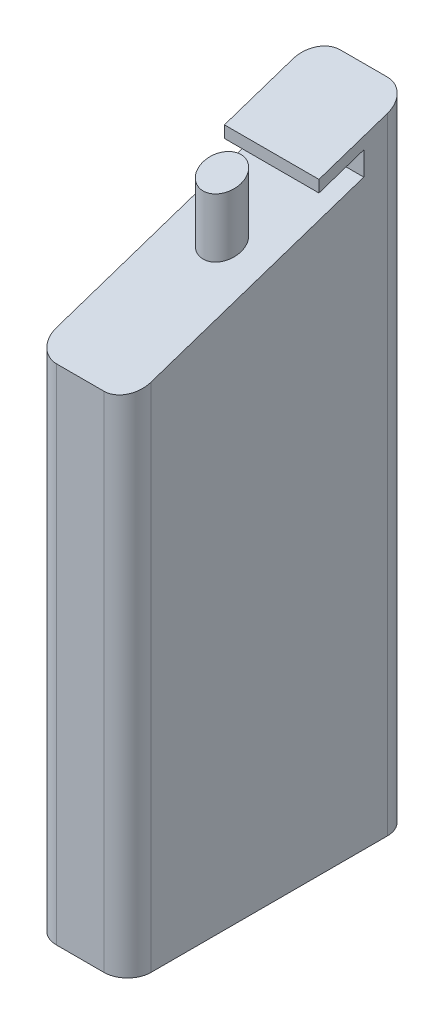
ISO-10303-21;
HEADER;
FILE_DESCRIPTION(('STEP AP214'),'2;1');
FILE_NAME('part.step','',(''),(''),'','','');
FILE_SCHEMA(('AUTOMOTIVE_DESIGN { 1 0 10303 214 1 1 1 1 }'));
ENDSEC;
DATA;
#1=APPLICATION_CONTEXT('core data for automotive mechanical design processes');
#2=APPLICATION_PROTOCOL_DEFINITION('international standard','automotive_design',2000,#1);
#3=PRODUCT_CONTEXT('',#1,'mechanical');
#4=PRODUCT('Part','Part','',(#3));
#5=PRODUCT_RELATED_PRODUCT_CATEGORY('part','',(#4));
#6=PRODUCT_DEFINITION_FORMATION('','',#4);
#7=PRODUCT_DEFINITION_CONTEXT('part definition',#1,'design');
#8=PRODUCT_DEFINITION('design','',#6,#7);
#9=PRODUCT_DEFINITION_SHAPE('','',#8);
#10=(LENGTH_UNIT() NAMED_UNIT(*) SI_UNIT(.MILLI.,.METRE.));
#11=(NAMED_UNIT(*) PLANE_ANGLE_UNIT() SI_UNIT($,.RADIAN.));
#12=(NAMED_UNIT(*) SI_UNIT($,.STERADIAN.) SOLID_ANGLE_UNIT());
#13=UNCERTAINTY_MEASURE_WITH_UNIT(LENGTH_MEASURE(1.E-05),#10,'distance_accuracy_value','');
#14=(GEOMETRIC_REPRESENTATION_CONTEXT(3) GLOBAL_UNCERTAINTY_ASSIGNED_CONTEXT((#13)) GLOBAL_UNIT_ASSIGNED_CONTEXT((#10,
#11,#12)) REPRESENTATION_CONTEXT('',''));
#15=CARTESIAN_POINT('',(0.,0.,0.));
#16=DIRECTION('',(0.,0.,1.));
#17=DIRECTION('',(1.,0.,0.));
#18=AXIS2_PLACEMENT_3D('',#15,#16,#17);
#19=CARTESIAN_POINT('',(-12.7,166.057639442324,-25.4));
#20=DIRECTION('',(0.,0.,-1.));
#21=DIRECTION('',(-1.,0.,0.));
#22=AXIS2_PLACEMENT_3D('',#19,#20,#21);
#23=PLANE('',#22);
#24=DIRECTION('',(1.,0.,0.));
#25=VECTOR('',#24,1.);
#26=CARTESIAN_POINT('',(-12.7,162.882639442324,-25.4));
#27=LINE('',#26,#25);
#28=CARTESIAN_POINT('',(-12.7,162.882639442324,-25.4));
#29=VERTEX_POINT('',#28);
#30=CARTESIAN_POINT('',(12.7,162.882639442324,-25.4));
#31=VERTEX_POINT('',#30);
#32=EDGE_CURVE('E145',#29,#31,#27,.T.);
#33=ORIENTED_EDGE('',*,*,#32,.F.);
#34=DIRECTION('',(0.,-1.,0.));
#35=VECTOR('',#34,1.);
#36=CARTESIAN_POINT('',(-12.7,166.057639442324,-25.4));
#37=LINE('',#36,#35);
#38=CARTESIAN_POINT('',(-12.7,156.532639442324,-25.4));
#39=VERTEX_POINT('',#38);
#40=EDGE_CURVE('E150',#29,#39,#37,.T.);
#41=ORIENTED_EDGE('',*,*,#40,.T.);
#42=DIRECTION('',(1.,0.,0.));
#43=VECTOR('',#42,1.);
#44=CARTESIAN_POINT('',(-12.7,156.532639442324,-25.4));
#45=LINE('',#44,#43);
#46=CARTESIAN_POINT('',(12.7,156.532639442324,-25.4));
#47=VERTEX_POINT('',#46);
#48=EDGE_CURVE('E151',#39,#47,#45,.T.);
#49=ORIENTED_EDGE('',*,*,#48,.T.);
#50=DIRECTION('',(0.,-1.,0.));
#51=VECTOR('',#50,1.);
#52=CARTESIAN_POINT('',(12.7,166.057639442324,-25.4));
#53=LINE('',#52,#51);
#54=EDGE_CURVE('E165',#31,#47,#53,.T.);
#55=ORIENTED_EDGE('',*,*,#54,.F.);
#56=EDGE_LOOP('',(#33,#41,#49,#55));
#57=FACE_BOUND('',#56,.T.);
#58=ADVANCED_FACE('F36',(#57),#23,.F.);
#59=CARTESIAN_POINT('',(-12.7,135.285836653942,38.1));
#60=DIRECTION('',(0.,-0.948323655206199,-0.317304656405093));
#61=DIRECTION('',(0.,0.317304656405093,-0.948323655206199));
#62=AXIS2_PLACEMENT_3D('',#59,#60,#61);
#63=PLANE('',#62);
#64=CARTESIAN_POINT('',(0.,146.334174103903,5.08));
#65=CARTESIAN_POINT('',(-10.16,146.334174103903,5.08));
#66=CARTESIAN_POINT('',(-10.16,149.733662550044,-5.08));
#67=CARTESIAN_POINT('',(0.,149.733662550044,-5.08));
#68=CARTESIAN_POINT('',(10.16,149.733662550044,-5.08));
#69=CARTESIAN_POINT('',(10.16,146.334174103903,5.08));
#70=CARTESIAN_POINT('',(0.,146.334174103903,5.08));
#71=(BOUNDED_CURVE() B_SPLINE_CURVE(3,(#64,#65,#66,#67,#68,#69,#70),.UNSPECIFIED.,.T.,
.F.) B_SPLINE_CURVE_WITH_KNOTS((4,3,4),(0.,0.5,1.),
.UNSPECIFIED.) CURVE() GEOMETRIC_REPRESENTATION_ITEM() RATIONAL_B_SPLINE_CURVE((1.,
0.333333333333333,0.333333333333333,1.,0.333333333333333,0.333333333333333,1.)) REPRESENTATION_ITEM(''));
#72=CARTESIAN_POINT('',(0.,146.334174103903,5.08));
#73=VERTEX_POINT('',#72);
#74=EDGE_CURVE('E292',#73,#73,#71,.T.);
#75=ORIENTED_EDGE('',*,*,#74,.T.);
#76=EDGE_LOOP('',(#75));
#77=FACE_BOUND('',#76,.T.);
#78=DIRECTION('',(0.,0.317304656405093,-0.948323655206199));
#79=VECTOR('',#78,1.);
#80=CARTESIAN_POINT('',(-12.7,135.285836653942,38.1));
#81=LINE('',#80,#79);
#82=CARTESIAN_POINT('',(-12.7,137.41051693278,31.75));
#83=VERTEX_POINT('',#82);
#84=EDGE_CURVE('E168',#83,#39,#81,.T.);
#85=ORIENTED_EDGE('',*,*,#84,.F.);
#86=CARTESIAN_POINT('',(-6.35,137.41051693278,31.75));
#87=DIRECTION('',(0.,-0.948323655206199,-0.317304656405093));
#88=DIRECTION('',(0.,0.317304656405093,-0.948323655206199));
#89=AXIS2_PLACEMENT_3D('',#86,#87,#88);
#90=ELLIPSE('',#89,6.69602615640679,6.35);
#91=CARTESIAN_POINT('',(-6.35,135.285836653942,38.1));
#92=VERTEX_POINT('',#91);
#93=EDGE_CURVE('E11',#83,#92,#90,.F.);
#94=ORIENTED_EDGE('',*,*,#93,.T.);
#95=DIRECTION('',(1.,0.,0.));
#96=VECTOR('',#95,1.);
#97=CARTESIAN_POINT('',(-12.7,135.285836653942,38.1));
#98=LINE('',#97,#96);
#99=CARTESIAN_POINT('',(6.35,135.285836653942,38.1));
#100=VERTEX_POINT('',#99);
#101=EDGE_CURVE('E171',#92,#100,#98,.T.);
#102=ORIENTED_EDGE('',*,*,#101,.T.);
#103=CARTESIAN_POINT('',(6.35,137.41051693278,31.75));
#104=DIRECTION('',(0.,-0.948323655206199,-0.317304656405093));
#105=DIRECTION('',(0.,-0.317304656405093,0.948323655206199));
#106=AXIS2_PLACEMENT_3D('',#103,#104,#105);
#107=ELLIPSE('',#106,6.69602615640679,6.35);
#108=CARTESIAN_POINT('',(12.7,137.41051693278,31.75));
#109=VERTEX_POINT('',#108);
#110=EDGE_CURVE('E44',#100,#109,#107,.F.);
#111=ORIENTED_EDGE('',*,*,#110,.T.);
#112=DIRECTION('',(0.,-0.317304656405093,0.948323655206199));
#113=VECTOR('',#112,1.);
#114=CARTESIAN_POINT('',(12.7,149.317423808953,-3.83599353359909));
#115=LINE('',#114,#113);
#116=EDGE_CURVE('E173',#47,#109,#115,.T.);
#117=ORIENTED_EDGE('',*,*,#116,.F.);
#118=ORIENTED_EDGE('',*,*,#48,.F.);
#119=EDGE_LOOP('',(#85,#94,#102,#111,#117,#118));
#120=FACE_BOUND('',#119,.T.);
#121=ADVANCED_FACE('F216',(#77,#120),#63,.F.);
#122=CARTESIAN_POINT('',(0.,160.782,38.1));
#123=DIRECTION('',(0.,0.,-1.));
#124=DIRECTION('',(-1.,0.,0.));
#125=AXIS2_PLACEMENT_3D('',#122,#123,#124);
#126=PLANE('',#125);
#127=ORIENTED_EDGE('',*,*,#101,.F.);
#128=DIRECTION('',(0.,-1.,0.));
#129=VECTOR('',#128,1.);
#130=CARTESIAN_POINT('',(-6.35,0.,38.1));
#131=LINE('',#130,#129);
#132=CARTESIAN_POINT('',(-6.35,0.,38.1));
#133=VERTEX_POINT('',#132);
#134=EDGE_CURVE('E212',#92,#133,#131,.T.);
#135=ORIENTED_EDGE('',*,*,#134,.T.);
#136=DIRECTION('',(1.,0.,0.));
#137=VECTOR('',#136,1.);
#138=CARTESIAN_POINT('',(0.,0.,38.1));
#139=LINE('',#138,#137);
#140=CARTESIAN_POINT('',(6.35,0.,38.1));
#141=VERTEX_POINT('',#140);
#142=EDGE_CURVE('E176',#133,#141,#139,.T.);
#143=ORIENTED_EDGE('',*,*,#142,.T.);
#144=DIRECTION('',(0.,-1.,0.));
#145=VECTOR('',#144,1.);
#146=CARTESIAN_POINT('',(6.35,160.782,38.1));
#147=LINE('',#146,#145);
#148=EDGE_CURVE('E51',#141,#100,#147,.F.);
#149=ORIENTED_EDGE('',*,*,#148,.T.);
#150=EDGE_LOOP('',(#127,#135,#143,#149));
#151=FACE_BOUND('',#150,.T.);
#152=ADVANCED_FACE('F230',(#151),#126,.F.);
#153=CARTESIAN_POINT('',(12.7,160.782,0.));
#154=DIRECTION('',(-1.,0.,0.));
#155=DIRECTION('',(0.,0.,1.));
#156=AXIS2_PLACEMENT_3D('',#153,#154,#155);
#157=PLANE('',#156);
#158=DIRECTION('',(0.,0.,-1.));
#159=VECTOR('',#158,1.);
#160=CARTESIAN_POINT('',(12.7,0.,0.));
#161=LINE('',#160,#159);
#162=CARTESIAN_POINT('',(12.7,0.,31.75));
#163=VERTEX_POINT('',#162);
#164=CARTESIAN_POINT('',(12.7,0.,-31.75));
#165=VERTEX_POINT('',#164);
#166=EDGE_CURVE('E229',#163,#165,#161,.T.);
#167=ORIENTED_EDGE('',*,*,#166,.T.);
#168=DIRECTION('',(0.,-1.,0.));
#169=VECTOR('',#168,1.);
#170=CARTESIAN_POINT('',(12.7,170.307,-31.75));
#171=LINE('',#170,#169);
#172=CARTESIAN_POINT('',(12.7,168.182319721162,-31.75));
#173=VERTEX_POINT('',#172);
#174=EDGE_CURVE('E209',#165,#173,#171,.F.);
#175=ORIENTED_EDGE('',*,*,#174,.T.);
#176=DIRECTION('',(0.,0.317304656405093,-0.948323655206199));
#177=VECTOR('',#176,1.);
#178=CARTESIAN_POINT('',(12.7,144.810836653942,38.1));
#179=LINE('',#178,#177);
#180=CARTESIAN_POINT('',(12.7,162.027870305979,-13.3562895788813));
#181=VERTEX_POINT('',#180);
#182=EDGE_CURVE('E163',#181,#173,#179,.T.);
#183=ORIENTED_EDGE('',*,*,#182,.F.);
#184=DIRECTION('',(0.,1.,0.));
#185=VECTOR('',#184,1.);
#186=CARTESIAN_POINT('',(12.7,162.027870305979,-13.3562895788813));
#187=LINE('',#186,#185);
#188=CARTESIAN_POINT('',(12.7,158.852870305979,-13.3562895788813));
#189=VERTEX_POINT('',#188);
#190=EDGE_CURVE('E135',#189,#181,#187,.T.);
#191=ORIENTED_EDGE('',*,*,#190,.F.);
#192=DIRECTION('',(0.,0.317304656405092,-0.948323655206199));
#193=VECTOR('',#192,1.);
#194=CARTESIAN_POINT('',(12.7,158.852870305979,-13.3562895788813));
#195=LINE('',#194,#193);
#196=EDGE_CURVE('E131',#189,#31,#195,.T.);
#197=ORIENTED_EDGE('',*,*,#196,.T.);
#198=ORIENTED_EDGE('',*,*,#54,.T.);
#199=ORIENTED_EDGE('',*,*,#116,.T.);
#200=DIRECTION('',(0.,-1.,0.));
#201=VECTOR('',#200,1.);
#202=CARTESIAN_POINT('',(12.7,160.782,31.75));
#203=LINE('',#202,#201);
#204=EDGE_CURVE('E206',#109,#163,#203,.T.);
#205=ORIENTED_EDGE('',*,*,#204,.T.);
#206=EDGE_LOOP('',(#167,#175,#183,#191,#197,#198,#199,#205));
#207=FACE_BOUND('',#206,.T.);
#208=ADVANCED_FACE('F222',(#207),#157,.F.);
#209=CARTESIAN_POINT('',(0.,160.782,-38.1));
#210=DIRECTION('',(0.,0.,-1.));
#211=DIRECTION('',(-1.,0.,0.));
#212=AXIS2_PLACEMENT_3D('',#209,#210,#211);
#213=PLANE('',#212);
#214=DIRECTION('',(1.,0.,0.));
#215=VECTOR('',#214,1.);
#216=CARTESIAN_POINT('',(0.,0.,-38.1));
#217=LINE('',#216,#215);
#218=CARTESIAN_POINT('',(-6.35,0.,-38.1));
#219=VERTEX_POINT('',#218);
#220=CARTESIAN_POINT('',(6.35,0.,-38.1));
#221=VERTEX_POINT('',#220);
#222=EDGE_CURVE('E232',#219,#221,#217,.T.);
#223=ORIENTED_EDGE('',*,*,#222,.F.);
#224=DIRECTION('',(0.,-1.,0.));
#225=VECTOR('',#224,1.);
#226=CARTESIAN_POINT('',(-6.35,160.782,-38.1));
#227=LINE('',#226,#225);
#228=CARTESIAN_POINT('',(-6.35,170.307,-38.1));
#229=VERTEX_POINT('',#228);
#230=EDGE_CURVE('E200',#219,#229,#227,.F.);
#231=ORIENTED_EDGE('',*,*,#230,.T.);
#232=DIRECTION('',(1.,0.,0.));
#233=VECTOR('',#232,1.);
#234=CARTESIAN_POINT('',(-12.7,170.307,-38.1));
#235=LINE('',#234,#233);
#236=CARTESIAN_POINT('',(6.34999999999999,170.307,-38.1));
#237=VERTEX_POINT('',#236);
#238=EDGE_CURVE('E160',#229,#237,#235,.T.);
#239=ORIENTED_EDGE('',*,*,#238,.T.);
#240=DIRECTION('',(0.,-1.,0.));
#241=VECTOR('',#240,1.);
#242=CARTESIAN_POINT('',(6.35,0.,-38.1));
#243=LINE('',#242,#241);
#244=EDGE_CURVE('E197',#237,#221,#243,.T.);
#245=ORIENTED_EDGE('',*,*,#244,.T.);
#246=EDGE_LOOP('',(#223,#231,#239,#245));
#247=FACE_BOUND('',#246,.T.);
#248=ADVANCED_FACE('F268',(#247),#213,.T.);
#249=CARTESIAN_POINT('',(-12.7,160.782,0.));
#250=DIRECTION('',(-1.,0.,0.));
#251=DIRECTION('',(0.,0.,1.));
#252=AXIS2_PLACEMENT_3D('',#249,#250,#251);
#253=PLANE('',#252);
#254=DIRECTION('',(0.,0.317304656405093,-0.948323655206199));
#255=VECTOR('',#254,1.);
#256=CARTESIAN_POINT('',(-12.7,144.810836653942,38.1));
#257=LINE('',#256,#255);
#258=CARTESIAN_POINT('',(-12.7,162.027870305979,-13.3562895788813));
#259=VERTEX_POINT('',#258);
#260=CARTESIAN_POINT('',(-12.7,168.182319721162,-31.75));
#261=VERTEX_POINT('',#260);
#262=EDGE_CURVE('E154',#259,#261,#257,.T.);
#263=ORIENTED_EDGE('',*,*,#262,.T.);
#264=DIRECTION('',(0.,-1.,0.));
#265=VECTOR('',#264,1.);
#266=CARTESIAN_POINT('',(-12.7,160.782,-31.75));
#267=LINE('',#266,#265);
#268=CARTESIAN_POINT('',(-12.7,0.,-31.75));
#269=VERTEX_POINT('',#268);
#270=EDGE_CURVE('E186',#261,#269,#267,.T.);
#271=ORIENTED_EDGE('',*,*,#270,.T.);
#272=DIRECTION('',(0.,0.,-1.));
#273=VECTOR('',#272,1.);
#274=CARTESIAN_POINT('',(-12.7,0.,0.));
#275=LINE('',#274,#273);
#276=CARTESIAN_POINT('',(-12.7,0.,31.75));
#277=VERTEX_POINT('',#276);
#278=EDGE_CURVE('E182',#277,#269,#275,.T.);
#279=ORIENTED_EDGE('',*,*,#278,.F.);
#280=DIRECTION('',(0.,-1.,0.));
#281=VECTOR('',#280,1.);
#282=CARTESIAN_POINT('',(-12.7,135.285836653942,31.75));
#283=LINE('',#282,#281);
#284=EDGE_CURVE('E184',#277,#83,#283,.F.);
#285=ORIENTED_EDGE('',*,*,#284,.T.);
#286=ORIENTED_EDGE('',*,*,#84,.T.);
#287=ORIENTED_EDGE('',*,*,#40,.F.);
#288=DIRECTION('',(0.,0.317304656405092,-0.948323655206199));
#289=VECTOR('',#288,1.);
#290=CARTESIAN_POINT('',(-12.7,158.852870305979,-13.3562895788813));
#291=LINE('',#290,#289);
#292=CARTESIAN_POINT('',(-12.7,158.852870305979,-13.3562895788813));
#293=VERTEX_POINT('',#292);
#294=EDGE_CURVE('E128',#293,#29,#291,.T.);
#295=ORIENTED_EDGE('',*,*,#294,.F.);
#296=DIRECTION('',(0.,-1.,0.));
#297=VECTOR('',#296,1.);
#298=CARTESIAN_POINT('',(-12.7,162.027870305979,-13.3562895788813));
#299=LINE('',#298,#297);
#300=EDGE_CURVE('E136',#259,#293,#299,.T.);
#301=ORIENTED_EDGE('',*,*,#300,.F.);
#302=EDGE_LOOP('',(#263,#271,#279,#285,#286,#287,#295,#301));
#303=FACE_BOUND('',#302,.T.);
#304=ADVANCED_FACE('F148',(#303),#253,.T.);
#305=CARTESIAN_POINT('',(0.,0.,0.));
#306=DIRECTION('',(0.,1.,0.));
#307=DIRECTION('',(0.,0.,1.));
#308=AXIS2_PLACEMENT_3D('',#305,#306,#307);
#309=PLANE('',#308);
#310=CARTESIAN_POINT('',(0.,0.,0.));
#311=DIRECTION('',(0.,-1.,0.));
#312=DIRECTION('',(0.,0.,-1.));
#313=AXIS2_PLACEMENT_3D('',#310,#311,#312);
#314=CIRCLE('',#313,5.715);
#315=CARTESIAN_POINT('',(0.,0.,-5.715));
#316=VERTEX_POINT('',#315);
#317=EDGE_CURVE('E302',#316,#316,#314,.T.);
#318=ORIENTED_EDGE('',*,*,#317,.F.);
#319=EDGE_LOOP('',(#318));
#320=FACE_BOUND('',#319,.T.);
#321=ORIENTED_EDGE('',*,*,#278,.T.);
#322=CARTESIAN_POINT('',(-6.35,0.,-31.75));
#323=DIRECTION('',(0.,1.,0.));
#324=DIRECTION('',(0.,0.,1.));
#325=AXIS2_PLACEMENT_3D('',#322,#323,#324);
#326=CIRCLE('',#325,6.35);
#327=EDGE_CURVE('E195',#269,#219,#326,.F.);
#328=ORIENTED_EDGE('',*,*,#327,.T.);
#329=ORIENTED_EDGE('',*,*,#222,.T.);
#330=CARTESIAN_POINT('',(6.35,0.,-31.75));
#331=DIRECTION('',(0.,1.,0.));
#332=DIRECTION('',(0.,0.,1.));
#333=AXIS2_PLACEMENT_3D('',#330,#331,#332);
#334=CIRCLE('',#333,6.35);
#335=EDGE_CURVE('E193',#221,#165,#334,.F.);
#336=ORIENTED_EDGE('',*,*,#335,.T.);
#337=ORIENTED_EDGE('',*,*,#166,.F.);
#338=CARTESIAN_POINT('',(6.35,0.,31.75));
#339=DIRECTION('',(0.,1.,0.));
#340=DIRECTION('',(0.,0.,1.));
#341=AXIS2_PLACEMENT_3D('',#338,#339,#340);
#342=CIRCLE('',#341,6.35);
#343=EDGE_CURVE('E189',#163,#141,#342,.F.);
#344=ORIENTED_EDGE('',*,*,#343,.T.);
#345=ORIENTED_EDGE('',*,*,#142,.F.);
#346=CARTESIAN_POINT('',(-6.35,0.,31.75));
#347=DIRECTION('',(0.,1.,0.));
#348=DIRECTION('',(0.,0.,1.));
#349=AXIS2_PLACEMENT_3D('',#346,#347,#348);
#350=CIRCLE('',#349,6.35);
#351=EDGE_CURVE('E191',#133,#277,#350,.F.);
#352=ORIENTED_EDGE('',*,*,#351,.T.);
#353=EDGE_LOOP('',(#321,#328,#329,#336,#337,#344,#345,#352));
#354=FACE_BOUND('',#353,.T.);
#355=ADVANCED_FACE('F228',(#320,#354),#309,.F.);
#356=CARTESIAN_POINT('',(0.,142.654531097165,44.5445179926173));
#357=DIRECTION('',(0.,-0.948323655206199,-0.317304656405093));
#358=DIRECTION('',(0.,0.317304656405093,-0.948323655206199));
#359=AXIS2_PLACEMENT_3D('',#356,#357,#358);
#360=PLANE('',#359);
#361=ORIENTED_EDGE('',*,*,#238,.F.);
#362=CARTESIAN_POINT('',(-6.35,168.182319721162,-31.75));
#363=DIRECTION('',(0.,-0.948323655206199,-0.317304656405093));
#364=DIRECTION('',(0.,-0.317304656405093,0.948323655206199));
#365=AXIS2_PLACEMENT_3D('',#362,#363,#364);
#366=ELLIPSE('',#365,6.69602615640679,6.35);
#367=EDGE_CURVE('E204',#229,#261,#366,.F.);
#368=ORIENTED_EDGE('',*,*,#367,.T.);
#369=ORIENTED_EDGE('',*,*,#262,.F.);
#370=DIRECTION('',(-1.,0.,0.));
#371=VECTOR('',#370,1.);
#372=CARTESIAN_POINT('',(-12.7,162.027870305979,-13.3562895788813));
#373=LINE('',#372,#371);
#374=EDGE_CURVE('E142',#181,#259,#373,.T.);
#375=ORIENTED_EDGE('',*,*,#374,.F.);
#376=ORIENTED_EDGE('',*,*,#182,.T.);
#377=CARTESIAN_POINT('',(6.35,168.182319721162,-31.75));
#378=DIRECTION('',(0.,-0.948323655206199,-0.317304656405093));
#379=DIRECTION('',(0.,0.317304656405093,-0.948323655206199));
#380=AXIS2_PLACEMENT_3D('',#377,#378,#379);
#381=ELLIPSE('',#380,6.69602615640679,6.35);
#382=EDGE_CURVE('E202',#173,#237,#381,.F.);
#383=ORIENTED_EDGE('',*,*,#382,.T.);
#384=EDGE_LOOP('',(#361,#368,#369,#375,#376,#383));
#385=FACE_BOUND('',#384,.T.);
#386=ADVANCED_FACE('F260',(#385),#360,.F.);
#387=CARTESIAN_POINT('',(-12.7,158.852870305979,-13.3562895788813));
#388=DIRECTION('',(0.,0.948323655206199,0.317304656405092));
#389=DIRECTION('',(0.,-0.317304656405092,0.9483236552062));
#390=AXIS2_PLACEMENT_3D('',#387,#388,#389);
#391=PLANE('',#390);
#392=ORIENTED_EDGE('',*,*,#32,.T.);
#393=ORIENTED_EDGE('',*,*,#196,.F.);
#394=DIRECTION('',(1.,0.,0.));
#395=VECTOR('',#394,1.);
#396=CARTESIAN_POINT('',(-12.7,158.852870305979,-13.3562895788813));
#397=LINE('',#396,#395);
#398=EDGE_CURVE('E124',#293,#189,#397,.T.);
#399=ORIENTED_EDGE('',*,*,#398,.F.);
#400=ORIENTED_EDGE('',*,*,#294,.T.);
#401=EDGE_LOOP('',(#392,#393,#399,#400));
#402=FACE_BOUND('',#401,.T.);
#403=ADVANCED_FACE('F126',(#402),#391,.F.);
#404=CARTESIAN_POINT('',(0.,-4.02976913634467,-13.3562895788813));
#405=DIRECTION('',(0.,0.,1.));
#406=DIRECTION('',(1.,0.,0.));
#407=AXIS2_PLACEMENT_3D('',#404,#405,#406);
#408=PLANE('',#407);
#409=ORIENTED_EDGE('',*,*,#300,.T.);
#410=ORIENTED_EDGE('',*,*,#398,.T.);
#411=ORIENTED_EDGE('',*,*,#190,.T.);
#412=ORIENTED_EDGE('',*,*,#374,.T.);
#413=EDGE_LOOP('',(#409,#410,#411,#412));
#414=FACE_BOUND('',#413,.T.);
#415=ADVANCED_FACE('F140',(#414),#408,.T.);
#416=CARTESIAN_POINT('',(-6.35,160.782,-31.75));
#417=DIRECTION('',(0.,-1.,0.));
#418=DIRECTION('',(0.,0.,-1.));
#419=AXIS2_PLACEMENT_3D('',#416,#417,#418);
#420=CYLINDRICAL_SURFACE('',#419,6.35);
#421=ORIENTED_EDGE('',*,*,#367,.F.);
#422=ORIENTED_EDGE('',*,*,#230,.F.);
#423=ORIENTED_EDGE('',*,*,#327,.F.);
#424=ORIENTED_EDGE('',*,*,#270,.F.);
#425=EDGE_LOOP('',(#421,#422,#423,#424));
#426=FACE_BOUND('',#425,.T.);
#427=ADVANCED_FACE('F248',(#426),#420,.T.);
#428=CARTESIAN_POINT('',(6.35,160.782,-31.75));
#429=DIRECTION('',(0.,1.,0.));
#430=DIRECTION('',(0.,0.,1.));
#431=AXIS2_PLACEMENT_3D('',#428,#429,#430);
#432=CYLINDRICAL_SURFACE('',#431,6.35);
#433=ORIENTED_EDGE('',*,*,#382,.F.);
#434=ORIENTED_EDGE('',*,*,#174,.F.);
#435=ORIENTED_EDGE('',*,*,#335,.F.);
#436=ORIENTED_EDGE('',*,*,#244,.F.);
#437=EDGE_LOOP('',(#433,#434,#435,#436));
#438=FACE_BOUND('',#437,.T.);
#439=ADVANCED_FACE('F242',(#438),#432,.T.);
#440=CARTESIAN_POINT('',(-6.35,160.782,31.75));
#441=DIRECTION('',(0.,1.,0.));
#442=DIRECTION('',(0.,0.,1.));
#443=AXIS2_PLACEMENT_3D('',#440,#441,#442);
#444=CYLINDRICAL_SURFACE('',#443,6.35);
#445=ORIENTED_EDGE('',*,*,#93,.F.);
#446=ORIENTED_EDGE('',*,*,#284,.F.);
#447=ORIENTED_EDGE('',*,*,#351,.F.);
#448=ORIENTED_EDGE('',*,*,#134,.F.);
#449=EDGE_LOOP('',(#445,#446,#447,#448));
#450=FACE_BOUND('',#449,.T.);
#451=ADVANCED_FACE('F240',(#450),#444,.T.);
#452=CARTESIAN_POINT('',(6.35,160.782,31.75));
#453=DIRECTION('',(0.,-1.,0.));
#454=DIRECTION('',(0.,0.,-1.));
#455=AXIS2_PLACEMENT_3D('',#452,#453,#454);
#456=CYLINDRICAL_SURFACE('',#455,6.35);
#457=ORIENTED_EDGE('',*,*,#110,.F.);
#458=ORIENTED_EDGE('',*,*,#148,.F.);
#459=ORIENTED_EDGE('',*,*,#343,.F.);
#460=ORIENTED_EDGE('',*,*,#204,.F.);
#461=EDGE_LOOP('',(#457,#458,#459,#460));
#462=FACE_BOUND('',#461,.T.);
#463=ADVANCED_FACE('F38',(#462),#456,.T.);
#464=CARTESIAN_POINT('',(0.,162.209174103903,0.));
#465=DIRECTION('',(0.,-1.,0.));
#466=DIRECTION('',(0.,0.,-1.));
#467=AXIS2_PLACEMENT_3D('',#464,#465,#466);
#468=CYLINDRICAL_SURFACE('',#467,5.08);
#469=CARTESIAN_POINT('',(0.,162.209174103903,5.08));
#470=CARTESIAN_POINT('',(-10.16,162.209174103903,5.08));
#471=CARTESIAN_POINT('',(-10.16,165.608662550044,-5.08));
#472=CARTESIAN_POINT('',(0.,165.608662550044,-5.08));
#473=CARTESIAN_POINT('',(10.16,165.608662550044,-5.08));
#474=CARTESIAN_POINT('',(10.16,162.209174103903,5.08));
#475=CARTESIAN_POINT('',(0.,162.209174103903,5.08));
#476=(BOUNDED_CURVE() B_SPLINE_CURVE(3,(#469,#470,#471,#472,#473,#474,#475),.UNSPECIFIED.,.T.,
.F.) B_SPLINE_CURVE_WITH_KNOTS((4,3,4),(0.,0.5,1.),
.UNSPECIFIED.) CURVE() GEOMETRIC_REPRESENTATION_ITEM() RATIONAL_B_SPLINE_CURVE((1.,
0.333333333333333,0.333333333333333,1.,0.333333333333333,0.333333333333333,1.)) REPRESENTATION_ITEM(''));
#477=CARTESIAN_POINT('',(0.,162.209174103903,5.08));
#478=VERTEX_POINT('',#477);
#479=EDGE_CURVE('E290',#478,#478,#476,.T.);
#480=ORIENTED_EDGE('',*,*,#479,.T.);
#481=EDGE_LOOP('',(#480));
#482=FACE_BOUND('',#481,.T.);
#483=ORIENTED_EDGE('',*,*,#74,.F.);
#484=EDGE_LOOP('',(#483));
#485=FACE_BOUND('',#484,.T.);
#486=ADVANCED_FACE('F247',(#482,#485),#468,.T.);
#487=CARTESIAN_POINT('',(0.,165.608662550044,-5.08));
#488=DIRECTION('',(0.,0.948323655206199,0.317304656405093));
#489=DIRECTION('',(0.,-0.317304656405093,0.948323655206199));
#490=AXIS2_PLACEMENT_3D('',#487,#488,#489);
#491=PLANE('',#490);
#492=ORIENTED_EDGE('',*,*,#479,.F.);
#493=EDGE_LOOP('',(#492));
#494=FACE_BOUND('',#493,.T.);
#495=ADVANCED_FACE('F321',(#494),#491,.T.);
#496=CARTESIAN_POINT('',(0.,15.875,0.));
#497=DIRECTION('',(0.,-1.,0.));
#498=DIRECTION('',(0.,0.,-1.));
#499=AXIS2_PLACEMENT_3D('',#496,#497,#498);
#500=CYLINDRICAL_SURFACE('',#499,5.715);
#501=CARTESIAN_POINT('',(0.,15.875,0.));
#502=DIRECTION('',(0.,-1.,0.));
#503=DIRECTION('',(0.,0.,-1.));
#504=AXIS2_PLACEMENT_3D('',#501,#502,#503);
#505=CIRCLE('',#504,5.715);
#506=CARTESIAN_POINT('',(0.,15.875,-5.715));
#507=VERTEX_POINT('',#506);
#508=EDGE_CURVE('E297',#507,#507,#505,.T.);
#509=ORIENTED_EDGE('',*,*,#508,.F.);
#510=EDGE_LOOP('',(#509));
#511=FACE_BOUND('',#510,.T.);
#512=ORIENTED_EDGE('',*,*,#317,.T.);
#513=EDGE_LOOP('',(#512));
#514=FACE_BOUND('',#513,.T.);
#515=ADVANCED_FACE('F318',(#511,#514),#500,.F.);
#516=CARTESIAN_POINT('',(0.,15.875,0.));
#517=DIRECTION('',(0.,-1.,0.));
#518=DIRECTION('',(0.,0.,-1.));
#519=AXIS2_PLACEMENT_3D('',#516,#517,#518);
#520=PLANE('',#519);
#521=ORIENTED_EDGE('',*,*,#508,.T.);
#522=EDGE_LOOP('',(#521));
#523=FACE_BOUND('',#522,.T.);
#524=ADVANCED_FACE('F316',(#523),#520,.T.);
#525=CLOSED_SHELL('',(#58,#121,#152,#208,#248,#304,#355,#386,#403,#415,#427,#439,#451,#463,#486,
#495,#515,#524));
#526=MANIFOLD_SOLID_BREP('B2',#525);
#527=ADVANCED_BREP_SHAPE_REPRESENTATION('',(#18,#526),#14);
#528=SHAPE_DEFINITION_REPRESENTATION(#9,#527);
ENDSEC;
END-ISO-10303-21;
